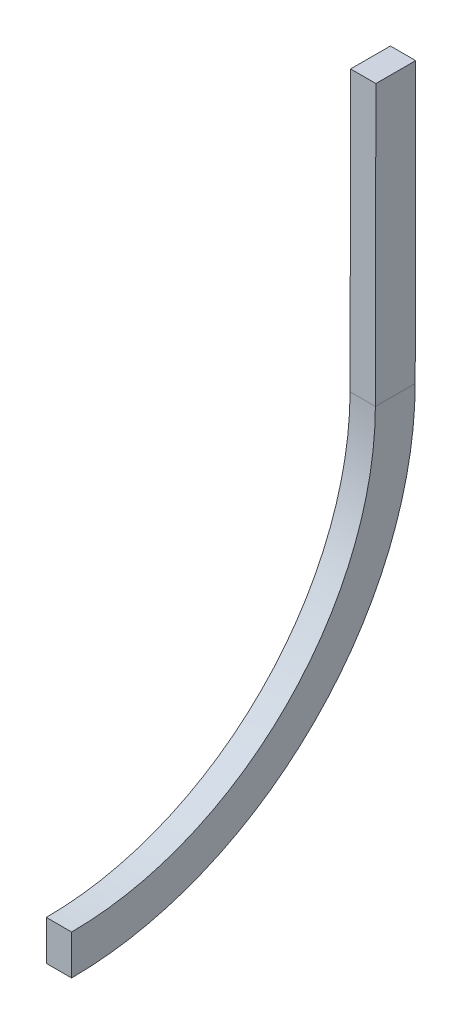
ISO-10303-21;
HEADER;
FILE_DESCRIPTION(('STEP AP214'),'2;1');
FILE_NAME('part.step','',(''),(''),'','','');
FILE_SCHEMA(('AUTOMOTIVE_DESIGN { 1 0 10303 214 1 1 1 1 }'));
ENDSEC;
DATA;
#1=APPLICATION_CONTEXT('core data for automotive mechanical design processes');
#2=APPLICATION_PROTOCOL_DEFINITION('international standard','automotive_design',2000,#1);
#3=PRODUCT_CONTEXT('',#1,'mechanical');
#4=PRODUCT('Part','Part','',(#3));
#5=PRODUCT_RELATED_PRODUCT_CATEGORY('part','',(#4));
#6=PRODUCT_DEFINITION_FORMATION('','',#4);
#7=PRODUCT_DEFINITION_CONTEXT('part definition',#1,'design');
#8=PRODUCT_DEFINITION('design','',#6,#7);
#9=PRODUCT_DEFINITION_SHAPE('','',#8);
#10=(LENGTH_UNIT() NAMED_UNIT(*) SI_UNIT(.MILLI.,.METRE.));
#11=(NAMED_UNIT(*) PLANE_ANGLE_UNIT() SI_UNIT($,.RADIAN.));
#12=(NAMED_UNIT(*) SI_UNIT($,.STERADIAN.) SOLID_ANGLE_UNIT());
#13=UNCERTAINTY_MEASURE_WITH_UNIT(LENGTH_MEASURE(1.E-05),#10,'distance_accuracy_value','');
#14=(GEOMETRIC_REPRESENTATION_CONTEXT(3) GLOBAL_UNCERTAINTY_ASSIGNED_CONTEXT((#13)) GLOBAL_UNIT_ASSIGNED_CONTEXT((#10,
#11,#12)) REPRESENTATION_CONTEXT('',''));
#15=CARTESIAN_POINT('',(0.,0.,0.));
#16=DIRECTION('',(0.,0.,1.));
#17=DIRECTION('',(1.,0.,0.));
#18=AXIS2_PLACEMENT_3D('',#15,#16,#17);
#19=CARTESIAN_POINT('',(0.,609.917253672596,-1.06450750501827));
#20=DIRECTION('',(0.,0.999998476913288,-0.00174532836589086));
#21=DIRECTION('',(0.,0.00174532836589086,0.999998476913288));
#22=AXIS2_PLACEMENT_3D('',#19,#20,#21);
#23=PLANE('',#22);
#24=DIRECTION('',(0.,-0.00174532836589086,-0.999998476913288));
#25=VECTOR('',#24,1.);
#26=CARTESIAN_POINT('',(12.7,609.936578138724,10.0075847575572));
#27=LINE('',#26,#25);
#28=CARTESIAN_POINT('',(12.7,610.006400000001,50.0125238264733));
#29=VERTEX_POINT('',#28);
#30=CARTESIAN_POINT('',(12.7,609.936578138724,10.0075847575572));
#31=VERTEX_POINT('',#30);
#32=EDGE_CURVE('E96',#29,#31,#27,.T.);
#33=ORIENTED_EDGE('',*,*,#32,.T.);
#34=DIRECTION('',(-1.,0.,0.));
#35=VECTOR('',#34,1.);
#36=CARTESIAN_POINT('',(-12.7,609.936578138724,10.0075847575572));
#37=LINE('',#36,#35);
#38=CARTESIAN_POINT('',(-12.7,609.936578138724,10.0075847575572));
#39=VERTEX_POINT('',#38);
#40=EDGE_CURVE('E118',#31,#39,#37,.T.);
#41=ORIENTED_EDGE('',*,*,#40,.T.);
#42=DIRECTION('',(0.,0.00174532836589086,0.999998476913288));
#43=VECTOR('',#42,1.);
#44=CARTESIAN_POINT('',(-12.7,609.936578138724,10.0075847575572));
#45=LINE('',#44,#43);
#46=CARTESIAN_POINT('',(-12.7,610.006400000001,50.0125238264733));
#47=VERTEX_POINT('',#46);
#48=EDGE_CURVE('E109',#39,#47,#45,.T.);
#49=ORIENTED_EDGE('',*,*,#48,.T.);
#50=DIRECTION('',(1.,0.,0.));
#51=VECTOR('',#50,1.);
#52=CARTESIAN_POINT('',(-12.7,610.006400000001,50.0125238264733));
#53=LINE('',#52,#51);
#54=EDGE_CURVE('E103',#47,#29,#53,.T.);
#55=ORIENTED_EDGE('',*,*,#54,.T.);
#56=EDGE_LOOP('',(#33,#41,#49,#55));
#57=FACE_BOUND('',#56,.T.);
#58=ADVANCED_FACE('F39',(#57),#23,.T.);
#59=CARTESIAN_POINT('',(0.,-26.0708091263579,355.504875649745));
#60=DIRECTION('',(0.,0.,-1.));
#61=DIRECTION('',(0.,1.,0.));
#62=AXIS2_PLACEMENT_3D('',#59,#60,#61);
#63=PLANE('',#62);
#64=DIRECTION('',(0.,-1.,0.));
#65=VECTOR('',#64,1.);
#66=CARTESIAN_POINT('',(12.7,-14.9987000000001,355.504875649745));
#67=LINE('',#66,#65);
#68=CARTESIAN_POINT('',(12.7,25.0062999999998,355.504875649745));
#69=VERTEX_POINT('',#68);
#70=CARTESIAN_POINT('',(12.7,-14.9987000000002,355.504875649745));
#71=VERTEX_POINT('',#70);
#72=EDGE_CURVE('E52',#69,#71,#67,.T.);
#73=ORIENTED_EDGE('',*,*,#72,.F.);
#74=DIRECTION('',(1.,0.,0.));
#75=VECTOR('',#74,1.);
#76=CARTESIAN_POINT('',(-12.7,25.0062999999999,355.504875649745));
#77=LINE('',#76,#75);
#78=CARTESIAN_POINT('',(-12.7,25.0062999999998,355.504875649745));
#79=VERTEX_POINT('',#78);
#80=EDGE_CURVE('E65',#79,#69,#77,.T.);
#81=ORIENTED_EDGE('',*,*,#80,.F.);
#82=DIRECTION('',(0.,1.,0.));
#83=VECTOR('',#82,1.);
#84=CARTESIAN_POINT('',(-12.7,-14.9987000000001,355.504875649745));
#85=LINE('',#84,#83);
#86=CARTESIAN_POINT('',(-12.7,-14.9987000000002,355.504875649745));
#87=VERTEX_POINT('',#86);
#88=EDGE_CURVE('E131',#87,#79,#85,.T.);
#89=ORIENTED_EDGE('',*,*,#88,.F.);
#90=DIRECTION('',(-1.,0.,0.));
#91=VECTOR('',#90,1.);
#92=CARTESIAN_POINT('',(-12.7,-14.9987000000001,355.504875649745));
#93=LINE('',#92,#91);
#94=EDGE_CURVE('E11',#71,#87,#93,.T.);
#95=ORIENTED_EDGE('',*,*,#94,.F.);
#96=EDGE_LOOP('',(#73,#81,#89,#95));
#97=FACE_BOUND('',#96,.T.);
#98=ADVANCED_FACE('F168',(#97),#63,.F.);
#99=CARTESIAN_POINT('',(-12.7,609.936578138724,10.0075847575572));
#100=DIRECTION('',(1.,0.,0.));
#101=DIRECTION('',(0.,0.,-1.));
#102=AXIS2_PLACEMENT_3D('',#99,#100,#101);
#103=PLANE('',#102);
#104=DIRECTION('',(0.,-0.999998476913288,0.00174532836589151));
#105=VECTOR('',#104,1.);
#106=CARTESIAN_POINT('',(-12.7,610.006400000001,50.0125238264733));
#107=LINE('',#106,#105);
#108=CARTESIAN_POINT('',(-12.7,329.477169263354,50.5021401960679));
#109=VERTEX_POINT('',#108);
#110=EDGE_CURVE('E116',#47,#109,#107,.T.);
#111=ORIENTED_EDGE('',*,*,#110,.F.);
#112=ORIENTED_EDGE('',*,*,#48,.F.);
#113=DIRECTION('',(0.,-0.999998476913288,0.00174532836589151));
#114=VECTOR('',#113,1.);
#115=CARTESIAN_POINT('',(-12.7,609.936578138724,10.0075847575572));
#116=LINE('',#115,#114);
#117=CARTESIAN_POINT('',(-12.7,329.407347402076,10.4972011271518));
#118=VERTEX_POINT('',#117);
#119=EDGE_CURVE('E113',#39,#118,#116,.T.);
#120=ORIENTED_EDGE('',*,*,#119,.T.);
#121=DIRECTION('',(0.,0.00174532836589086,0.999998476913288));
#122=VECTOR('',#121,1.);
#123=CARTESIAN_POINT('',(-12.7,329.407347402076,10.4972011271518));
#124=LINE('',#123,#122);
#125=EDGE_CURVE('E127',#118,#109,#124,.T.);
#126=ORIENTED_EDGE('',*,*,#125,.T.);
#127=EDGE_LOOP('',(#111,#112,#120,#126));
#128=FACE_BOUND('',#127,.T.);
#129=ADVANCED_FACE('F115',(#128),#103,.F.);
#130=CARTESIAN_POINT('',(-12.7,610.006400000001,50.0125238264733));
#131=DIRECTION('',(0.,-0.00174532836589151,-0.999998476913288));
#132=DIRECTION('',(0.,0.999998476913288,-0.00174532836589151));
#133=AXIS2_PLACEMENT_3D('',#130,#131,#132);
#134=PLANE('',#133);
#135=DIRECTION('',(0.,-0.999998476913288,0.00174532836589151));
#136=VECTOR('',#135,1.);
#137=CARTESIAN_POINT('',(12.7,610.006400000001,50.0125238264733));
#138=LINE('',#137,#136);
#139=CARTESIAN_POINT('',(12.7,329.477169263354,50.5021401960679));
#140=VERTEX_POINT('',#139);
#141=EDGE_CURVE('E143',#29,#140,#138,.T.);
#142=ORIENTED_EDGE('',*,*,#141,.F.);
#143=ORIENTED_EDGE('',*,*,#54,.F.);
#144=ORIENTED_EDGE('',*,*,#110,.T.);
#145=DIRECTION('',(1.,0.,0.));
#146=VECTOR('',#145,1.);
#147=CARTESIAN_POINT('',(-12.7,329.477169263354,50.5021401960679));
#148=LINE('',#147,#146);
#149=EDGE_CURVE('E139',#109,#140,#148,.T.);
#150=ORIENTED_EDGE('',*,*,#149,.T.);
#151=EDGE_LOOP('',(#142,#143,#144,#150));
#152=FACE_BOUND('',#151,.T.);
#153=ADVANCED_FACE('F177',(#152),#134,.F.);
#154=CARTESIAN_POINT('',(12.7,609.936578138724,10.0075847575572));
#155=DIRECTION('',(-1.,0.,0.));
#156=DIRECTION('',(0.,0.,1.));
#157=AXIS2_PLACEMENT_3D('',#154,#155,#156);
#158=PLANE('',#157);
#159=DIRECTION('',(0.,-0.999998476913288,0.00174532836589151));
#160=VECTOR('',#159,1.);
#161=CARTESIAN_POINT('',(12.7,609.936578138724,10.0075847575572));
#162=LINE('',#161,#160);
#163=CARTESIAN_POINT('',(12.7,329.407347402076,10.4972011271518));
#164=VERTEX_POINT('',#163);
#165=EDGE_CURVE('E149',#31,#164,#162,.T.);
#166=ORIENTED_EDGE('',*,*,#165,.F.);
#167=ORIENTED_EDGE('',*,*,#32,.F.);
#168=ORIENTED_EDGE('',*,*,#141,.T.);
#169=DIRECTION('',(0.,-0.00174532836589086,-0.999998476913288));
#170=VECTOR('',#169,1.);
#171=CARTESIAN_POINT('',(12.7,329.407347402076,10.4972011271518));
#172=LINE('',#171,#170);
#173=EDGE_CURVE('E141',#140,#164,#172,.T.);
#174=ORIENTED_EDGE('',*,*,#173,.T.);
#175=EDGE_LOOP('',(#166,#167,#168,#174));
#176=FACE_BOUND('',#175,.T.);
#177=ADVANCED_FACE('F154',(#176),#158,.F.);
#178=CARTESIAN_POINT('',(-12.7,609.936578138724,10.0075847575572));
#179=DIRECTION('',(0.,0.00174532836589151,0.999998476913288));
#180=DIRECTION('',(0.,-0.999998476913288,0.00174532836589151));
#181=AXIS2_PLACEMENT_3D('',#178,#179,#180);
#182=PLANE('',#181);
#183=DIRECTION('',(-1.,0.,0.));
#184=VECTOR('',#183,1.);
#185=CARTESIAN_POINT('',(-12.7,329.407347402076,10.4972011271518));
#186=LINE('',#185,#184);
#187=EDGE_CURVE('E125',#164,#118,#186,.T.);
#188=ORIENTED_EDGE('',*,*,#187,.T.);
#189=ORIENTED_EDGE('',*,*,#119,.F.);
#190=ORIENTED_EDGE('',*,*,#40,.F.);
#191=ORIENTED_EDGE('',*,*,#165,.T.);
#192=EDGE_LOOP('',(#188,#189,#190,#191));
#193=FACE_BOUND('',#192,.T.);
#194=ADVANCED_FACE('F123',(#193),#182,.F.);
#195=CARTESIAN_POINT('',(-12.7,329.407347402076,10.4972011271515));
#196=DIRECTION('',(1.,0.,0.));
#197=DIRECTION('',(0.,0.,-1.));
#198=AXIS2_PLACEMENT_3D('',#195,#196,#197);
#199=PLANE('',#198);
#200=CARTESIAN_POINT('',(-12.7,330.0095,355.504875649747));
#201=DIRECTION('',(-1.,0.,0.));
#202=DIRECTION('',(0.,-0.00174532836588651,-0.999998476913288));
#203=AXIS2_PLACEMENT_3D('',#200,#201,#202);
#204=CIRCLE('',#203,305.0032);
#205=EDGE_CURVE('E88',#109,#79,#204,.T.);
#206=ORIENTED_EDGE('',*,*,#205,.F.);
#207=ORIENTED_EDGE('',*,*,#125,.F.);
#208=CARTESIAN_POINT('',(-12.7,330.0095,355.504875649747));
#209=DIRECTION('',(-1.,0.,0.));
#210=DIRECTION('',(0.,-0.00174532836588702,-0.999998476913288));
#211=AXIS2_PLACEMENT_3D('',#208,#209,#210);
#212=CIRCLE('',#211,345.0082);
#213=EDGE_CURVE('E132',#118,#87,#212,.T.);
#214=ORIENTED_EDGE('',*,*,#213,.T.);
#215=ORIENTED_EDGE('',*,*,#88,.T.);
#216=EDGE_LOOP('',(#206,#207,#214,#215));
#217=FACE_BOUND('',#216,.T.);
#218=ADVANCED_FACE('F164',(#217),#199,.F.);
#219=CARTESIAN_POINT('',(0.,330.0095,355.504875649747));
#220=DIRECTION('',(-1.,0.,0.));
#221=DIRECTION('',(0.,0.,1.));
#222=AXIS2_PLACEMENT_3D('',#219,#220,#221);
#223=CYLINDRICAL_SURFACE('',#222,305.0032);
#224=CARTESIAN_POINT('',(12.7,330.0095,355.504875649747));
#225=DIRECTION('',(-1.,0.,0.));
#226=DIRECTION('',(0.,-0.00174532836588651,-0.999998476913288));
#227=AXIS2_PLACEMENT_3D('',#224,#225,#226);
#228=CIRCLE('',#227,305.0032);
#229=EDGE_CURVE('E81',#140,#69,#228,.T.);
#230=ORIENTED_EDGE('',*,*,#229,.F.);
#231=ORIENTED_EDGE('',*,*,#149,.F.);
#232=ORIENTED_EDGE('',*,*,#205,.T.);
#233=ORIENTED_EDGE('',*,*,#80,.T.);
#234=EDGE_LOOP('',(#230,#231,#232,#233));
#235=FACE_BOUND('',#234,.T.);
#236=ADVANCED_FACE('F158',(#235),#223,.F.);
#237=CARTESIAN_POINT('',(12.7,329.407347402076,10.4972011271515));
#238=DIRECTION('',(-1.,0.,0.));
#239=DIRECTION('',(0.,0.,1.));
#240=AXIS2_PLACEMENT_3D('',#237,#238,#239);
#241=PLANE('',#240);
#242=CARTESIAN_POINT('',(12.7,330.0095,355.504875649747));
#243=DIRECTION('',(-1.,0.,0.));
#244=DIRECTION('',(0.,-0.00174532836588702,-0.999998476913288));
#245=AXIS2_PLACEMENT_3D('',#242,#243,#244);
#246=CIRCLE('',#245,345.0082);
#247=EDGE_CURVE('E46',#164,#71,#246,.T.);
#248=ORIENTED_EDGE('',*,*,#247,.F.);
#249=ORIENTED_EDGE('',*,*,#173,.F.);
#250=ORIENTED_EDGE('',*,*,#229,.T.);
#251=ORIENTED_EDGE('',*,*,#72,.T.);
#252=EDGE_LOOP('',(#248,#249,#250,#251));
#253=FACE_BOUND('',#252,.T.);
#254=ADVANCED_FACE('F156',(#253),#241,.F.);
#255=CARTESIAN_POINT('',(0.,330.0095,355.504875649747));
#256=DIRECTION('',(-1.,0.,0.));
#257=DIRECTION('',(0.,0.,1.));
#258=AXIS2_PLACEMENT_3D('',#255,#256,#257);
#259=CYLINDRICAL_SURFACE('',#258,345.0082);
#260=ORIENTED_EDGE('',*,*,#94,.T.);
#261=ORIENTED_EDGE('',*,*,#213,.F.);
#262=ORIENTED_EDGE('',*,*,#187,.F.);
#263=ORIENTED_EDGE('',*,*,#247,.T.);
#264=EDGE_LOOP('',(#260,#261,#262,#263));
#265=FACE_BOUND('',#264,.T.);
#266=ADVANCED_FACE('F153',(#265),#259,.T.);
#267=CLOSED_SHELL('',(#58,#98,#129,#153,#177,#194,#218,#236,#254,#266));
#268=MANIFOLD_SOLID_BREP('B2',#267);
#269=ADVANCED_BREP_SHAPE_REPRESENTATION('',(#18,#268),#14);
#270=SHAPE_DEFINITION_REPRESENTATION(#9,#269);
ENDSEC;
END-ISO-10303-21;
